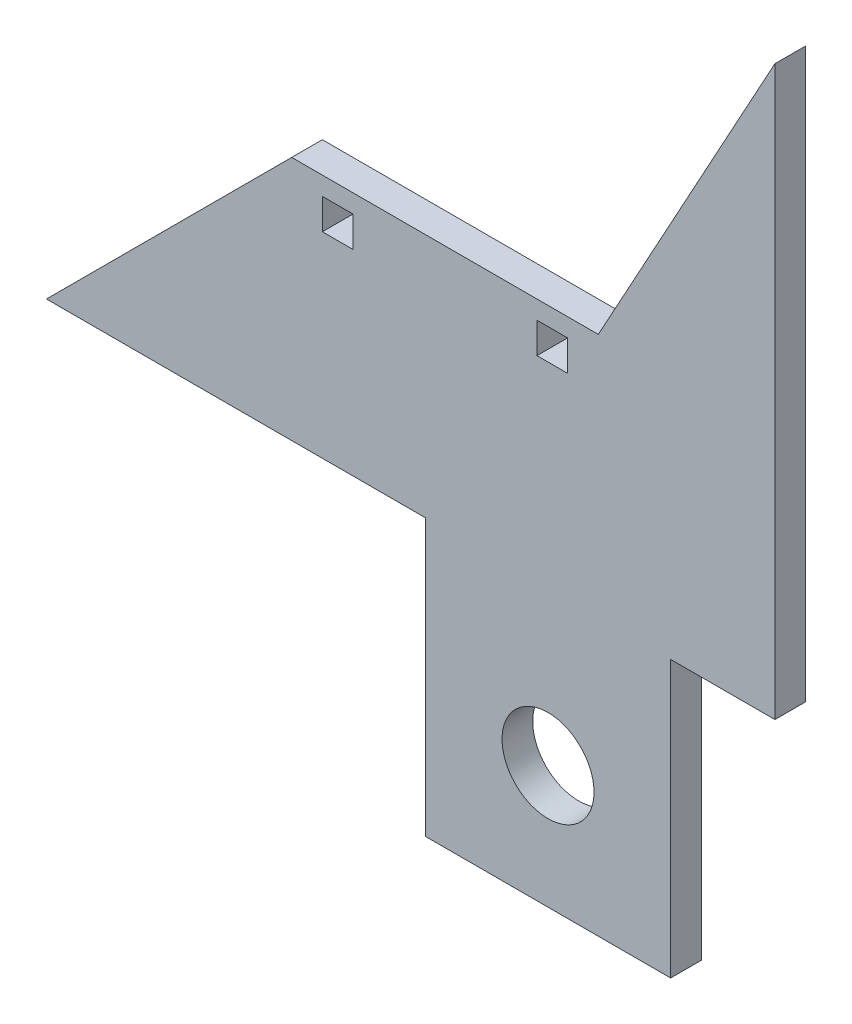
ISO-10303-21;
HEADER;
FILE_DESCRIPTION(('STEP AP214'),'2;1');
FILE_NAME('part.step','',(''),(''),'','','');
FILE_SCHEMA(('AUTOMOTIVE_DESIGN { 1 0 10303 214 1 1 1 1 }'));
ENDSEC;
DATA;
#1=APPLICATION_CONTEXT('core data for automotive mechanical design processes');
#2=APPLICATION_PROTOCOL_DEFINITION('international standard','automotive_design',2000,#1);
#3=PRODUCT_CONTEXT('',#1,'mechanical');
#4=PRODUCT('Part','Part','',(#3));
#5=PRODUCT_RELATED_PRODUCT_CATEGORY('part','',(#4));
#6=PRODUCT_DEFINITION_FORMATION('','',#4);
#7=PRODUCT_DEFINITION_CONTEXT('part definition',#1,'design');
#8=PRODUCT_DEFINITION('design','',#6,#7);
#9=PRODUCT_DEFINITION_SHAPE('','',#8);
#10=(LENGTH_UNIT() NAMED_UNIT(*) SI_UNIT(.MILLI.,.METRE.));
#11=(NAMED_UNIT(*) PLANE_ANGLE_UNIT() SI_UNIT($,.RADIAN.));
#12=(NAMED_UNIT(*) SI_UNIT($,.STERADIAN.) SOLID_ANGLE_UNIT());
#13=UNCERTAINTY_MEASURE_WITH_UNIT(LENGTH_MEASURE(1.E-05),#10,'distance_accuracy_value','');
#14=(GEOMETRIC_REPRESENTATION_CONTEXT(3) GLOBAL_UNCERTAINTY_ASSIGNED_CONTEXT((#13)) GLOBAL_UNIT_ASSIGNED_CONTEXT((#10,
#11,#12)) REPRESENTATION_CONTEXT('',''));
#15=CARTESIAN_POINT('',(0.,0.,0.));
#16=DIRECTION('',(0.,0.,1.));
#17=DIRECTION('',(1.,0.,0.));
#18=AXIS2_PLACEMENT_3D('',#15,#16,#17);
#19=CARTESIAN_POINT('',(-40.,-19.3506493506493,5.));
#20=DIRECTION('',(0.,1.,0.));
#21=DIRECTION('',(-1.,0.,0.));
#22=AXIS2_PLACEMENT_3D('',#19,#20,#21);
#23=PLANE('',#22);
#24=DIRECTION('',(1.,0.,0.));
#25=VECTOR('',#24,1.);
#26=CARTESIAN_POINT('',(-40.,-19.3506493506493,0.));
#27=LINE('',#26,#25);
#28=CARTESIAN_POINT('',(-101.802768985002,-19.3506493506494,0.));
#29=VERTEX_POINT('',#28);
#30=CARTESIAN_POINT('',(-40.,-19.3506493506493,0.));
#31=VERTEX_POINT('',#30);
#32=EDGE_CURVE('E191',#29,#31,#27,.T.);
#33=ORIENTED_EDGE('',*,*,#32,.T.);
#34=DIRECTION('',(0.,0.,-1.));
#35=VECTOR('',#34,1.);
#36=CARTESIAN_POINT('',(-40.,-19.3506493506493,5.));
#37=LINE('',#36,#35);
#38=CARTESIAN_POINT('',(-40.,-19.3506493506493,5.));
#39=VERTEX_POINT('',#38);
#40=EDGE_CURVE('E11',#39,#31,#37,.T.);
#41=ORIENTED_EDGE('',*,*,#40,.F.);
#42=DIRECTION('',(1.,0.,0.));
#43=VECTOR('',#42,1.);
#44=CARTESIAN_POINT('',(-101.802768985002,-19.3506493506494,5.));
#45=LINE('',#44,#43);
#46=CARTESIAN_POINT('',(-101.802768985002,-19.3506493506494,5.));
#47=VERTEX_POINT('',#46);
#48=EDGE_CURVE('E224',#47,#39,#45,.T.);
#49=ORIENTED_EDGE('',*,*,#48,.F.);
#50=DIRECTION('',(0.,0.,-1.));
#51=VECTOR('',#50,1.);
#52=CARTESIAN_POINT('',(-101.802768985002,-19.3506493506494,5.));
#53=LINE('',#52,#51);
#54=EDGE_CURVE('E243',#47,#29,#53,.T.);
#55=ORIENTED_EDGE('',*,*,#54,.T.);
#56=EDGE_LOOP('',(#33,#41,#49,#55));
#57=FACE_BOUND('',#56,.T.);
#58=ADVANCED_FACE('F33',(#57),#23,.F.);
#59=CARTESIAN_POINT('',(-40.,-64.3506493506493,5.));
#60=DIRECTION('',(1.,0.,0.));
#61=DIRECTION('',(0.,1.,0.));
#62=AXIS2_PLACEMENT_3D('',#59,#60,#61);
#63=PLANE('',#62);
#64=DIRECTION('',(0.,-1.,0.));
#65=VECTOR('',#64,1.);
#66=CARTESIAN_POINT('',(-40.,-64.3506493506493,0.));
#67=LINE('',#66,#65);
#68=CARTESIAN_POINT('',(-40.,-64.3506493506493,0.));
#69=VERTEX_POINT('',#68);
#70=EDGE_CURVE('E245',#31,#69,#67,.T.);
#71=ORIENTED_EDGE('',*,*,#70,.T.);
#72=DIRECTION('',(0.,0.,-1.));
#73=VECTOR('',#72,1.);
#74=CARTESIAN_POINT('',(-40.,-64.3506493506493,5.));
#75=LINE('',#74,#73);
#76=CARTESIAN_POINT('',(-40.,-64.3506493506493,5.));
#77=VERTEX_POINT('',#76);
#78=EDGE_CURVE('E41',#77,#69,#75,.T.);
#79=ORIENTED_EDGE('',*,*,#78,.F.);
#80=DIRECTION('',(0.,-1.,0.));
#81=VECTOR('',#80,1.);
#82=CARTESIAN_POINT('',(-40.,-64.3506493506493,5.));
#83=LINE('',#82,#81);
#84=EDGE_CURVE('E226',#39,#77,#83,.T.);
#85=ORIENTED_EDGE('',*,*,#84,.F.);
#86=ORIENTED_EDGE('',*,*,#40,.T.);
#87=EDGE_LOOP('',(#71,#79,#85,#86));
#88=FACE_BOUND('',#87,.T.);
#89=ADVANCED_FACE('F309',(#88),#63,.F.);
#90=CARTESIAN_POINT('',(0.,-64.3506493506493,5.));
#91=DIRECTION('',(0.,1.,0.));
#92=DIRECTION('',(-1.,0.,0.));
#93=AXIS2_PLACEMENT_3D('',#90,#91,#92);
#94=PLANE('',#93);
#95=DIRECTION('',(1.,0.,0.));
#96=VECTOR('',#95,1.);
#97=CARTESIAN_POINT('',(0.,-64.3506493506493,0.));
#98=LINE('',#97,#96);
#99=CARTESIAN_POINT('',(0.,-64.3506493506493,0.));
#100=VERTEX_POINT('',#99);
#101=EDGE_CURVE('E247',#69,#100,#98,.T.);
#102=ORIENTED_EDGE('',*,*,#101,.T.);
#103=DIRECTION('',(0.,0.,-1.));
#104=VECTOR('',#103,1.);
#105=CARTESIAN_POINT('',(0.,-64.3506493506493,5.));
#106=LINE('',#105,#104);
#107=CARTESIAN_POINT('',(0.,-64.3506493506493,5.));
#108=VERTEX_POINT('',#107);
#109=EDGE_CURVE('E278',#108,#100,#106,.T.);
#110=ORIENTED_EDGE('',*,*,#109,.F.);
#111=DIRECTION('',(1.,0.,0.));
#112=VECTOR('',#111,1.);
#113=CARTESIAN_POINT('',(0.,-64.3506493506493,5.));
#114=LINE('',#113,#112);
#115=EDGE_CURVE('E229',#77,#108,#114,.T.);
#116=ORIENTED_EDGE('',*,*,#115,.F.);
#117=ORIENTED_EDGE('',*,*,#78,.T.);
#118=EDGE_LOOP('',(#102,#110,#116,#117));
#119=FACE_BOUND('',#118,.T.);
#120=ADVANCED_FACE('F286',(#119),#94,.F.);
#121=CARTESIAN_POINT('',(0.,-19.3506493506493,5.));
#122=DIRECTION('',(-1.,0.,0.));
#123=DIRECTION('',(0.,-1.,0.));
#124=AXIS2_PLACEMENT_3D('',#121,#122,#123);
#125=PLANE('',#124);
#126=DIRECTION('',(0.,1.,0.));
#127=VECTOR('',#126,1.);
#128=CARTESIAN_POINT('',(0.,-19.3506493506493,0.));
#129=LINE('',#128,#127);
#130=CARTESIAN_POINT('',(0.,-19.3506493506493,0.));
#131=VERTEX_POINT('',#130);
#132=EDGE_CURVE('E249',#100,#131,#129,.T.);
#133=ORIENTED_EDGE('',*,*,#132,.T.);
#134=DIRECTION('',(0.,0.,-1.));
#135=VECTOR('',#134,1.);
#136=CARTESIAN_POINT('',(0.,-19.3506493506493,5.));
#137=LINE('',#136,#135);
#138=CARTESIAN_POINT('',(0.,-19.3506493506493,5.));
#139=VERTEX_POINT('',#138);
#140=EDGE_CURVE('E275',#139,#131,#137,.T.);
#141=ORIENTED_EDGE('',*,*,#140,.F.);
#142=DIRECTION('',(0.,1.,0.));
#143=VECTOR('',#142,1.);
#144=CARTESIAN_POINT('',(0.,-19.3506493506493,5.));
#145=LINE('',#144,#143);
#146=EDGE_CURVE('E231',#108,#139,#145,.T.);
#147=ORIENTED_EDGE('',*,*,#146,.F.);
#148=ORIENTED_EDGE('',*,*,#109,.T.);
#149=EDGE_LOOP('',(#133,#141,#147,#148));
#150=FACE_BOUND('',#149,.T.);
#151=ADVANCED_FACE('F297',(#150),#125,.F.);
#152=CARTESIAN_POINT('',(17.,-19.3506493506493,5.));
#153=DIRECTION('',(0.,1.,0.));
#154=DIRECTION('',(-1.,0.,0.));
#155=AXIS2_PLACEMENT_3D('',#152,#153,#154);
#156=PLANE('',#155);
#157=DIRECTION('',(1.,0.,0.));
#158=VECTOR('',#157,1.);
#159=CARTESIAN_POINT('',(17.,-19.3506493506493,0.));
#160=LINE('',#159,#158);
#161=CARTESIAN_POINT('',(17.,-19.3506493506493,0.));
#162=VERTEX_POINT('',#161);
#163=EDGE_CURVE('E251',#131,#162,#160,.T.);
#164=ORIENTED_EDGE('',*,*,#163,.T.);
#165=DIRECTION('',(0.,0.,-1.));
#166=VECTOR('',#165,1.);
#167=CARTESIAN_POINT('',(17.,-19.3506493506493,5.));
#168=LINE('',#167,#166);
#169=CARTESIAN_POINT('',(17.,-19.3506493506493,5.));
#170=VERTEX_POINT('',#169);
#171=EDGE_CURVE('E272',#170,#162,#168,.T.);
#172=ORIENTED_EDGE('',*,*,#171,.F.);
#173=DIRECTION('',(1.,0.,0.));
#174=VECTOR('',#173,1.);
#175=CARTESIAN_POINT('',(17.,-19.3506493506493,5.));
#176=LINE('',#175,#174);
#177=EDGE_CURVE('E233',#139,#170,#176,.T.);
#178=ORIENTED_EDGE('',*,*,#177,.F.);
#179=ORIENTED_EDGE('',*,*,#140,.T.);
#180=EDGE_LOOP('',(#164,#172,#178,#179));
#181=FACE_BOUND('',#180,.T.);
#182=ADVANCED_FACE('F301',(#181),#156,.F.);
#183=CARTESIAN_POINT('',(17.,73.2839447752356,5.));
#184=DIRECTION('',(-1.,0.,0.));
#185=DIRECTION('',(0.,-1.,0.));
#186=AXIS2_PLACEMENT_3D('',#183,#184,#185);
#187=PLANE('',#186);
#188=DIRECTION('',(0.,1.,0.));
#189=VECTOR('',#188,1.);
#190=CARTESIAN_POINT('',(17.,73.2839447752356,0.));
#191=LINE('',#190,#189);
#192=CARTESIAN_POINT('',(17.,73.2839447752356,0.));
#193=VERTEX_POINT('',#192);
#194=EDGE_CURVE('E253',#162,#193,#191,.T.);
#195=ORIENTED_EDGE('',*,*,#194,.T.);
#196=DIRECTION('',(0.,0.,-1.));
#197=VECTOR('',#196,1.);
#198=CARTESIAN_POINT('',(17.,73.2839447752356,5.));
#199=LINE('',#198,#197);
#200=CARTESIAN_POINT('',(17.,73.2839447752356,5.));
#201=VERTEX_POINT('',#200);
#202=EDGE_CURVE('E269',#201,#193,#199,.T.);
#203=ORIENTED_EDGE('',*,*,#202,.F.);
#204=DIRECTION('',(0.,1.,0.));
#205=VECTOR('',#204,1.);
#206=CARTESIAN_POINT('',(17.,73.2839447752356,5.));
#207=LINE('',#206,#205);
#208=EDGE_CURVE('E235',#170,#201,#207,.T.);
#209=ORIENTED_EDGE('',*,*,#208,.F.);
#210=ORIENTED_EDGE('',*,*,#171,.T.);
#211=EDGE_LOOP('',(#195,#203,#209,#210));
#212=FACE_BOUND('',#211,.T.);
#213=ADVANCED_FACE('F327',(#212),#187,.F.);
#214=CARTESIAN_POINT('',(-11.8027689850014,20.6493506493507,5.));
#215=DIRECTION('',(0.877243235431416,-0.480046149750023,0.));
#216=DIRECTION('',(0.480046149750023,0.877243235431416,0.));
#217=AXIS2_PLACEMENT_3D('',#214,#215,#216);
#218=PLANE('',#217);
#219=DIRECTION('',(-0.480046149750023,-0.877243235431416,0.));
#220=VECTOR('',#219,1.);
#221=CARTESIAN_POINT('',(-11.8027689850014,20.6493506493507,0.));
#222=LINE('',#221,#220);
#223=CARTESIAN_POINT('',(-11.8027689850014,20.6493506493507,0.));
#224=VERTEX_POINT('',#223);
#225=EDGE_CURVE('E255',#193,#224,#222,.T.);
#226=ORIENTED_EDGE('',*,*,#225,.T.);
#227=DIRECTION('',(0.,0.,-1.));
#228=VECTOR('',#227,1.);
#229=CARTESIAN_POINT('',(-11.8027689850014,20.6493506493507,5.));
#230=LINE('',#229,#228);
#231=CARTESIAN_POINT('',(-11.8027689850014,20.6493506493507,5.));
#232=VERTEX_POINT('',#231);
#233=EDGE_CURVE('E266',#232,#224,#230,.T.);
#234=ORIENTED_EDGE('',*,*,#233,.F.);
#235=DIRECTION('',(-0.480046149750023,-0.877243235431416,0.));
#236=VECTOR('',#235,1.);
#237=CARTESIAN_POINT('',(-11.8027689850014,20.6493506493507,5.));
#238=LINE('',#237,#236);
#239=EDGE_CURVE('E237',#201,#232,#238,.T.);
#240=ORIENTED_EDGE('',*,*,#239,.F.);
#241=ORIENTED_EDGE('',*,*,#202,.T.);
#242=EDGE_LOOP('',(#226,#234,#240,#241));
#243=FACE_BOUND('',#242,.T.);
#244=ADVANCED_FACE('F324',(#243),#218,.F.);
#245=CARTESIAN_POINT('',(-61.8027689850014,20.6493506493507,5.));
#246=DIRECTION('',(0.,-1.,0.));
#247=DIRECTION('',(1.,0.,0.));
#248=AXIS2_PLACEMENT_3D('',#245,#246,#247);
#249=PLANE('',#248);
#250=DIRECTION('',(-1.,0.,0.));
#251=VECTOR('',#250,1.);
#252=CARTESIAN_POINT('',(-61.8027689850014,20.6493506493507,0.));
#253=LINE('',#252,#251);
#254=CARTESIAN_POINT('',(-61.8027689850014,20.6493506493507,0.));
#255=VERTEX_POINT('',#254);
#256=EDGE_CURVE('E257',#224,#255,#253,.T.);
#257=ORIENTED_EDGE('',*,*,#256,.T.);
#258=DIRECTION('',(0.,0.,-1.));
#259=VECTOR('',#258,1.);
#260=CARTESIAN_POINT('',(-61.8027689850014,20.6493506493507,5.));
#261=LINE('',#260,#259);
#262=CARTESIAN_POINT('',(-61.8027689850014,20.6493506493507,5.));
#263=VERTEX_POINT('',#262);
#264=EDGE_CURVE('E263',#263,#255,#261,.T.);
#265=ORIENTED_EDGE('',*,*,#264,.F.);
#266=DIRECTION('',(-1.,0.,0.));
#267=VECTOR('',#266,1.);
#268=CARTESIAN_POINT('',(-61.8027689850014,20.6493506493507,5.));
#269=LINE('',#268,#267);
#270=EDGE_CURVE('E239',#232,#263,#269,.T.);
#271=ORIENTED_EDGE('',*,*,#270,.F.);
#272=ORIENTED_EDGE('',*,*,#233,.T.);
#273=EDGE_LOOP('',(#257,#265,#271,#272));
#274=FACE_BOUND('',#273,.T.);
#275=ADVANCED_FACE('F320',(#274),#249,.F.);
#276=CARTESIAN_POINT('',(-61.8027689850014,20.6493506493507,5.));
#277=DIRECTION('',(0.707106781186544,-0.707106781186551,0.));
#278=DIRECTION('',(0.707106781186551,0.707106781186544,0.));
#279=AXIS2_PLACEMENT_3D('',#276,#277,#278);
#280=PLANE('',#279);
#281=DIRECTION('',(-0.707106781186551,-0.707106781186544,0.));
#282=VECTOR('',#281,1.);
#283=CARTESIAN_POINT('',(-61.8027689850014,20.6493506493507,0.));
#284=LINE('',#283,#282);
#285=EDGE_CURVE('E227',#255,#29,#284,.T.);
#286=ORIENTED_EDGE('',*,*,#285,.T.);
#287=ORIENTED_EDGE('',*,*,#54,.F.);
#288=DIRECTION('',(-0.707106781186551,-0.707106781186544,0.));
#289=VECTOR('',#288,1.);
#290=CARTESIAN_POINT('',(-61.8027689850014,20.6493506493507,5.));
#291=LINE('',#290,#289);
#292=EDGE_CURVE('E241',#263,#47,#291,.T.);
#293=ORIENTED_EDGE('',*,*,#292,.F.);
#294=ORIENTED_EDGE('',*,*,#264,.T.);
#295=EDGE_LOOP('',(#286,#287,#293,#294));
#296=FACE_BOUND('',#295,.T.);
#297=ADVANCED_FACE('F315',(#296),#280,.F.);
#298=CARTESIAN_POINT('',(0.,0.,5.));
#299=DIRECTION('',(0.,0.,1.));
#300=DIRECTION('',(1.,0.,0.));
#301=AXIS2_PLACEMENT_3D('',#298,#299,#300);
#302=PLANE('',#301);
#303=CARTESIAN_POINT('',(-20.,-44.3506493506493,5.));
#304=DIRECTION('',(0.,0.,1.));
#305=DIRECTION('',(1.,0.,0.));
#306=AXIS2_PLACEMENT_3D('',#303,#304,#305);
#307=CIRCLE('',#306,7.5);
#308=CARTESIAN_POINT('',(-12.5,-44.3506493506493,5.));
#309=VERTEX_POINT('',#308);
#310=EDGE_CURVE('E179',#309,#309,#307,.T.);
#311=ORIENTED_EDGE('',*,*,#310,.F.);
#312=EDGE_LOOP('',(#311));
#313=FACE_BOUND('',#312,.T.);
#314=DIRECTION('',(0.,1.,0.));
#315=VECTOR('',#314,1.);
#316=CARTESIAN_POINT('',(-51.8027689850014,17.6493506493507,5.));
#317=LINE('',#316,#315);
#318=CARTESIAN_POINT('',(-51.8027689850014,12.6493506493506,5.));
#319=VERTEX_POINT('',#318);
#320=CARTESIAN_POINT('',(-51.8027689850014,17.6493506493507,5.));
#321=VERTEX_POINT('',#320);
#322=EDGE_CURVE('E48',#319,#321,#317,.T.);
#323=ORIENTED_EDGE('',*,*,#322,.F.);
#324=DIRECTION('',(1.,0.,0.));
#325=VECTOR('',#324,1.);
#326=CARTESIAN_POINT('',(-56.8027689850014,12.6493506493506,5.));
#327=LINE('',#326,#325);
#328=CARTESIAN_POINT('',(-56.8027689850014,12.6493506493506,5.));
#329=VERTEX_POINT('',#328);
#330=EDGE_CURVE('E173',#329,#319,#327,.T.);
#331=ORIENTED_EDGE('',*,*,#330,.F.);
#332=DIRECTION('',(0.,-1.,0.));
#333=VECTOR('',#332,1.);
#334=CARTESIAN_POINT('',(-56.8027689850014,17.6493506493507,5.));
#335=LINE('',#334,#333);
#336=CARTESIAN_POINT('',(-56.8027689850014,17.6493506493507,5.));
#337=VERTEX_POINT('',#336);
#338=EDGE_CURVE('E176',#337,#329,#335,.T.);
#339=ORIENTED_EDGE('',*,*,#338,.F.);
#340=DIRECTION('',(-1.,0.,0.));
#341=VECTOR('',#340,1.);
#342=CARTESIAN_POINT('',(-56.8027689850014,17.6493506493507,5.));
#343=LINE('',#342,#341);
#344=EDGE_CURVE('E184',#321,#337,#343,.T.);
#345=ORIENTED_EDGE('',*,*,#344,.F.);
#346=EDGE_LOOP('',(#323,#331,#339,#345));
#347=FACE_BOUND('',#346,.T.);
#348=DIRECTION('',(0.,1.,0.));
#349=VECTOR('',#348,1.);
#350=CARTESIAN_POINT('',(-16.8027689850014,12.6493506493506,5.));
#351=LINE('',#350,#349);
#352=CARTESIAN_POINT('',(-16.8027689850014,12.6493506493506,5.));
#353=VERTEX_POINT('',#352);
#354=CARTESIAN_POINT('',(-16.8027689850014,17.6493506493507,5.));
#355=VERTEX_POINT('',#354);
#356=EDGE_CURVE('E56',#353,#355,#351,.T.);
#357=ORIENTED_EDGE('',*,*,#356,.F.);
#358=DIRECTION('',(1.,0.,0.));
#359=VECTOR('',#358,1.);
#360=CARTESIAN_POINT('',(-21.8027689850014,12.6493506493506,5.));
#361=LINE('',#360,#359);
#362=CARTESIAN_POINT('',(-21.8027689850014,12.6493506493506,5.));
#363=VERTEX_POINT('',#362);
#364=EDGE_CURVE('E199',#363,#353,#361,.T.);
#365=ORIENTED_EDGE('',*,*,#364,.F.);
#366=DIRECTION('',(0.,-1.,0.));
#367=VECTOR('',#366,1.);
#368=CARTESIAN_POINT('',(-21.8027689850014,12.6493506493506,5.));
#369=LINE('',#368,#367);
#370=CARTESIAN_POINT('',(-21.8027689850014,17.6493506493507,5.));
#371=VERTEX_POINT('',#370);
#372=EDGE_CURVE('E213',#371,#363,#369,.T.);
#373=ORIENTED_EDGE('',*,*,#372,.F.);
#374=DIRECTION('',(-1.,0.,0.));
#375=VECTOR('',#374,1.);
#376=CARTESIAN_POINT('',(-21.8027689850014,17.6493506493507,5.));
#377=LINE('',#376,#375);
#378=EDGE_CURVE('E210',#355,#371,#377,.T.);
#379=ORIENTED_EDGE('',*,*,#378,.F.);
#380=EDGE_LOOP('',(#357,#365,#373,#379));
#381=FACE_BOUND('',#380,.T.);
#382=ORIENTED_EDGE('',*,*,#48,.T.);
#383=ORIENTED_EDGE('',*,*,#84,.T.);
#384=ORIENTED_EDGE('',*,*,#115,.T.);
#385=ORIENTED_EDGE('',*,*,#146,.T.);
#386=ORIENTED_EDGE('',*,*,#177,.T.);
#387=ORIENTED_EDGE('',*,*,#208,.T.);
#388=ORIENTED_EDGE('',*,*,#239,.T.);
#389=ORIENTED_EDGE('',*,*,#270,.T.);
#390=ORIENTED_EDGE('',*,*,#292,.T.);
#391=EDGE_LOOP('',(#382,#383,#384,#385,#386,#387,#388,#389,#390));
#392=FACE_BOUND('',#391,.T.);
#393=ADVANCED_FACE('F305',(#313,#347,#381,#392),#302,.T.);
#394=CARTESIAN_POINT('',(0.,0.,0.));
#395=DIRECTION('',(0.,0.,1.));
#396=DIRECTION('',(1.,0.,0.));
#397=AXIS2_PLACEMENT_3D('',#394,#395,#396);
#398=PLANE('',#397);
#399=CARTESIAN_POINT('',(-20.,-44.3506493506493,0.));
#400=DIRECTION('',(0.,0.,1.));
#401=DIRECTION('',(1.,0.,0.));
#402=AXIS2_PLACEMENT_3D('',#399,#400,#401);
#403=CIRCLE('',#402,7.5);
#404=CARTESIAN_POINT('',(-12.5,-44.3506493506493,0.));
#405=VERTEX_POINT('',#404);
#406=EDGE_CURVE('E36',#405,#405,#403,.T.);
#407=ORIENTED_EDGE('',*,*,#406,.T.);
#408=EDGE_LOOP('',(#407));
#409=FACE_BOUND('',#408,.T.);
#410=DIRECTION('',(1.,0.,0.));
#411=VECTOR('',#410,1.);
#412=CARTESIAN_POINT('',(-56.8027689850014,12.6493506493506,0.));
#413=LINE('',#412,#411);
#414=CARTESIAN_POINT('',(-56.8027689850014,12.6493506493506,0.));
#415=VERTEX_POINT('',#414);
#416=CARTESIAN_POINT('',(-51.8027689850014,12.6493506493506,0.));
#417=VERTEX_POINT('',#416);
#418=EDGE_CURVE('E160',#415,#417,#413,.T.);
#419=ORIENTED_EDGE('',*,*,#418,.T.);
#420=DIRECTION('',(0.,1.,0.));
#421=VECTOR('',#420,1.);
#422=CARTESIAN_POINT('',(-51.8027689850014,17.6493506493507,0.));
#423=LINE('',#422,#421);
#424=CARTESIAN_POINT('',(-51.8027689850014,17.6493506493507,0.));
#425=VERTEX_POINT('',#424);
#426=EDGE_CURVE('E154',#417,#425,#423,.T.);
#427=ORIENTED_EDGE('',*,*,#426,.T.);
#428=DIRECTION('',(-1.,0.,0.));
#429=VECTOR('',#428,1.);
#430=CARTESIAN_POINT('',(-56.8027689850014,17.6493506493507,0.));
#431=LINE('',#430,#429);
#432=CARTESIAN_POINT('',(-56.8027689850014,17.6493506493507,0.));
#433=VERTEX_POINT('',#432);
#434=EDGE_CURVE('E164',#425,#433,#431,.T.);
#435=ORIENTED_EDGE('',*,*,#434,.T.);
#436=DIRECTION('',(0.,-1.,0.));
#437=VECTOR('',#436,1.);
#438=CARTESIAN_POINT('',(-56.8027689850014,17.6493506493507,0.));
#439=LINE('',#438,#437);
#440=EDGE_CURVE('E168',#433,#415,#439,.T.);
#441=ORIENTED_EDGE('',*,*,#440,.T.);
#442=EDGE_LOOP('',(#419,#427,#435,#441));
#443=FACE_BOUND('',#442,.T.);
#444=DIRECTION('',(1.,0.,0.));
#445=VECTOR('',#444,1.);
#446=CARTESIAN_POINT('',(-21.8027689850014,12.6493506493506,0.));
#447=LINE('',#446,#445);
#448=CARTESIAN_POINT('',(-21.8027689850014,12.6493506493506,0.));
#449=VERTEX_POINT('',#448);
#450=CARTESIAN_POINT('',(-16.8027689850014,12.6493506493506,0.));
#451=VERTEX_POINT('',#450);
#452=EDGE_CURVE('E205',#449,#451,#447,.T.);
#453=ORIENTED_EDGE('',*,*,#452,.T.);
#454=DIRECTION('',(0.,1.,0.));
#455=VECTOR('',#454,1.);
#456=CARTESIAN_POINT('',(-16.8027689850014,12.6493506493506,0.));
#457=LINE('',#456,#455);
#458=CARTESIAN_POINT('',(-16.8027689850014,17.6493506493507,0.));
#459=VERTEX_POINT('',#458);
#460=EDGE_CURVE('E195',#451,#459,#457,.T.);
#461=ORIENTED_EDGE('',*,*,#460,.T.);
#462=DIRECTION('',(-1.,0.,0.));
#463=VECTOR('',#462,1.);
#464=CARTESIAN_POINT('',(-21.8027689850014,17.6493506493507,0.));
#465=LINE('',#464,#463);
#466=CARTESIAN_POINT('',(-21.8027689850014,17.6493506493507,0.));
#467=VERTEX_POINT('',#466);
#468=EDGE_CURVE('E198',#459,#467,#465,.T.);
#469=ORIENTED_EDGE('',*,*,#468,.T.);
#470=DIRECTION('',(0.,-1.,0.));
#471=VECTOR('',#470,1.);
#472=CARTESIAN_POINT('',(-21.8027689850014,12.6493506493506,0.));
#473=LINE('',#472,#471);
#474=EDGE_CURVE('E202',#467,#449,#473,.T.);
#475=ORIENTED_EDGE('',*,*,#474,.T.);
#476=EDGE_LOOP('',(#453,#461,#469,#475));
#477=FACE_BOUND('',#476,.T.);
#478=ORIENTED_EDGE('',*,*,#32,.F.);
#479=ORIENTED_EDGE('',*,*,#285,.F.);
#480=ORIENTED_EDGE('',*,*,#256,.F.);
#481=ORIENTED_EDGE('',*,*,#225,.F.);
#482=ORIENTED_EDGE('',*,*,#194,.F.);
#483=ORIENTED_EDGE('',*,*,#163,.F.);
#484=ORIENTED_EDGE('',*,*,#132,.F.);
#485=ORIENTED_EDGE('',*,*,#101,.F.);
#486=ORIENTED_EDGE('',*,*,#70,.F.);
#487=EDGE_LOOP('',(#478,#479,#480,#481,#482,#483,#484,#485,#486));
#488=FACE_BOUND('',#487,.T.);
#489=ADVANCED_FACE('F170',(#409,#443,#477,#488),#398,.F.);
#490=CARTESIAN_POINT('',(-16.8027689850014,12.6493506493506,0.));
#491=DIRECTION('',(1.,0.,0.));
#492=DIRECTION('',(0.,0.,-1.));
#493=AXIS2_PLACEMENT_3D('',#490,#491,#492);
#494=PLANE('',#493);
#495=ORIENTED_EDGE('',*,*,#356,.T.);
#496=DIRECTION('',(0.,0.,1.));
#497=VECTOR('',#496,1.);
#498=CARTESIAN_POINT('',(-16.8027689850014,17.6493506493507,0.));
#499=LINE('',#498,#497);
#500=EDGE_CURVE('E208',#459,#355,#499,.T.);
#501=ORIENTED_EDGE('',*,*,#500,.F.);
#502=ORIENTED_EDGE('',*,*,#460,.F.);
#503=DIRECTION('',(0.,0.,1.));
#504=VECTOR('',#503,1.);
#505=CARTESIAN_POINT('',(-16.8027689850014,12.6493506493506,0.));
#506=LINE('',#505,#504);
#507=EDGE_CURVE('E185',#451,#353,#506,.T.);
#508=ORIENTED_EDGE('',*,*,#507,.T.);
#509=EDGE_LOOP('',(#495,#501,#502,#508));
#510=FACE_BOUND('',#509,.T.);
#511=ADVANCED_FACE('F387',(#510),#494,.F.);
#512=CARTESIAN_POINT('',(-21.8027689850014,12.6493506493506,0.));
#513=DIRECTION('',(0.,-1.,0.));
#514=DIRECTION('',(0.,0.,-1.));
#515=AXIS2_PLACEMENT_3D('',#512,#513,#514);
#516=PLANE('',#515);
#517=ORIENTED_EDGE('',*,*,#364,.T.);
#518=ORIENTED_EDGE('',*,*,#507,.F.);
#519=ORIENTED_EDGE('',*,*,#452,.F.);
#520=DIRECTION('',(0.,0.,1.));
#521=VECTOR('',#520,1.);
#522=CARTESIAN_POINT('',(-21.8027689850014,12.6493506493506,0.));
#523=LINE('',#522,#521);
#524=EDGE_CURVE('E219',#449,#363,#523,.T.);
#525=ORIENTED_EDGE('',*,*,#524,.T.);
#526=EDGE_LOOP('',(#517,#518,#519,#525));
#527=FACE_BOUND('',#526,.T.);
#528=ADVANCED_FACE('F392',(#527),#516,.F.);
#529=CARTESIAN_POINT('',(-21.8027689850014,12.6493506493506,0.));
#530=DIRECTION('',(-1.,0.,0.));
#531=DIRECTION('',(0.,0.,1.));
#532=AXIS2_PLACEMENT_3D('',#529,#530,#531);
#533=PLANE('',#532);
#534=ORIENTED_EDGE('',*,*,#372,.T.);
#535=ORIENTED_EDGE('',*,*,#524,.F.);
#536=ORIENTED_EDGE('',*,*,#474,.F.);
#537=DIRECTION('',(0.,0.,1.));
#538=VECTOR('',#537,1.);
#539=CARTESIAN_POINT('',(-21.8027689850014,17.6493506493507,0.));
#540=LINE('',#539,#538);
#541=EDGE_CURVE('E221',#467,#371,#540,.T.);
#542=ORIENTED_EDGE('',*,*,#541,.T.);
#543=EDGE_LOOP('',(#534,#535,#536,#542));
#544=FACE_BOUND('',#543,.T.);
#545=ADVANCED_FACE('F403',(#544),#533,.F.);
#546=CARTESIAN_POINT('',(-21.8027689850014,17.6493506493507,0.));
#547=DIRECTION('',(0.,1.,0.));
#548=DIRECTION('',(0.,0.,1.));
#549=AXIS2_PLACEMENT_3D('',#546,#547,#548);
#550=PLANE('',#549);
#551=ORIENTED_EDGE('',*,*,#378,.T.);
#552=ORIENTED_EDGE('',*,*,#541,.F.);
#553=ORIENTED_EDGE('',*,*,#468,.F.);
#554=ORIENTED_EDGE('',*,*,#500,.T.);
#555=EDGE_LOOP('',(#551,#552,#553,#554));
#556=FACE_BOUND('',#555,.T.);
#557=ADVANCED_FACE('F413',(#556),#550,.F.);
#558=CARTESIAN_POINT('',(-51.8027689850014,17.6493506493507,0.));
#559=DIRECTION('',(1.,0.,0.));
#560=DIRECTION('',(0.,0.,-1.));
#561=AXIS2_PLACEMENT_3D('',#558,#559,#560);
#562=PLANE('',#561);
#563=ORIENTED_EDGE('',*,*,#322,.T.);
#564=DIRECTION('',(0.,0.,1.));
#565=VECTOR('',#564,1.);
#566=CARTESIAN_POINT('',(-51.8027689850014,17.6493506493507,0.));
#567=LINE('',#566,#565);
#568=EDGE_CURVE('E150',#425,#321,#567,.T.);
#569=ORIENTED_EDGE('',*,*,#568,.F.);
#570=ORIENTED_EDGE('',*,*,#426,.F.);
#571=DIRECTION('',(0.,0.,1.));
#572=VECTOR('',#571,1.);
#573=CARTESIAN_POINT('',(-51.8027689850014,12.6493506493506,0.));
#574=LINE('',#573,#572);
#575=EDGE_CURVE('E189',#417,#319,#574,.T.);
#576=ORIENTED_EDGE('',*,*,#575,.T.);
#577=EDGE_LOOP('',(#563,#569,#570,#576));
#578=FACE_BOUND('',#577,.T.);
#579=ADVANCED_FACE('F152',(#578),#562,.F.);
#580=CARTESIAN_POINT('',(-56.8027689850014,12.6493506493506,0.));
#581=DIRECTION('',(0.,-1.,0.));
#582=DIRECTION('',(0.,0.,-1.));
#583=AXIS2_PLACEMENT_3D('',#580,#581,#582);
#584=PLANE('',#583);
#585=ORIENTED_EDGE('',*,*,#330,.T.);
#586=ORIENTED_EDGE('',*,*,#575,.F.);
#587=ORIENTED_EDGE('',*,*,#418,.F.);
#588=DIRECTION('',(0.,0.,1.));
#589=VECTOR('',#588,1.);
#590=CARTESIAN_POINT('',(-56.8027689850014,12.6493506493506,0.));
#591=LINE('',#590,#589);
#592=EDGE_CURVE('E192',#415,#329,#591,.T.);
#593=ORIENTED_EDGE('',*,*,#592,.T.);
#594=EDGE_LOOP('',(#585,#586,#587,#593));
#595=FACE_BOUND('',#594,.T.);
#596=ADVANCED_FACE('F432',(#595),#584,.F.);
#597=CARTESIAN_POINT('',(-56.8027689850014,17.6493506493507,0.));
#598=DIRECTION('',(-1.,0.,0.));
#599=DIRECTION('',(0.,0.,1.));
#600=AXIS2_PLACEMENT_3D('',#597,#598,#599);
#601=PLANE('',#600);
#602=ORIENTED_EDGE('',*,*,#338,.T.);
#603=ORIENTED_EDGE('',*,*,#592,.F.);
#604=ORIENTED_EDGE('',*,*,#440,.F.);
#605=DIRECTION('',(0.,0.,1.));
#606=VECTOR('',#605,1.);
#607=CARTESIAN_POINT('',(-56.8027689850014,17.6493506493507,0.));
#608=LINE('',#607,#606);
#609=EDGE_CURVE('E159',#433,#337,#608,.T.);
#610=ORIENTED_EDGE('',*,*,#609,.T.);
#611=EDGE_LOOP('',(#602,#603,#604,#610));
#612=FACE_BOUND('',#611,.T.);
#613=ADVANCED_FACE('F441',(#612),#601,.F.);
#614=CARTESIAN_POINT('',(-56.8027689850014,17.6493506493507,0.));
#615=DIRECTION('',(0.,1.,0.));
#616=DIRECTION('',(0.,0.,1.));
#617=AXIS2_PLACEMENT_3D('',#614,#615,#616);
#618=PLANE('',#617);
#619=ORIENTED_EDGE('',*,*,#344,.T.);
#620=ORIENTED_EDGE('',*,*,#609,.F.);
#621=ORIENTED_EDGE('',*,*,#434,.F.);
#622=ORIENTED_EDGE('',*,*,#568,.T.);
#623=EDGE_LOOP('',(#619,#620,#621,#622));
#624=FACE_BOUND('',#623,.T.);
#625=ADVANCED_FACE('F165',(#624),#618,.F.);
#626=CARTESIAN_POINT('',(-20.,-44.3506493506493,-5.));
#627=DIRECTION('',(0.,0.,1.));
#628=DIRECTION('',(1.,0.,0.));
#629=AXIS2_PLACEMENT_3D('',#626,#627,#628);
#630=CYLINDRICAL_SURFACE('',#629,7.5);
#631=ORIENTED_EDGE('',*,*,#310,.T.);
#632=EDGE_LOOP('',(#631));
#633=FACE_BOUND('',#632,.T.);
#634=ORIENTED_EDGE('',*,*,#406,.F.);
#635=EDGE_LOOP('',(#634));
#636=FACE_BOUND('',#635,.T.);
#637=ADVANCED_FACE('F460',(#633,#636),#630,.F.);
#638=CLOSED_SHELL('',(#58,#89,#120,#151,#182,#213,#244,#275,#297,#393,#489,#511,#528,#545,#557,
#579,#596,#613,#625,#637));
#639=MANIFOLD_SOLID_BREP('B2',#638);
#640=ADVANCED_BREP_SHAPE_REPRESENTATION('',(#18,#639),#14);
#641=SHAPE_DEFINITION_REPRESENTATION(#9,#640);
ENDSEC;
END-ISO-10303-21;
